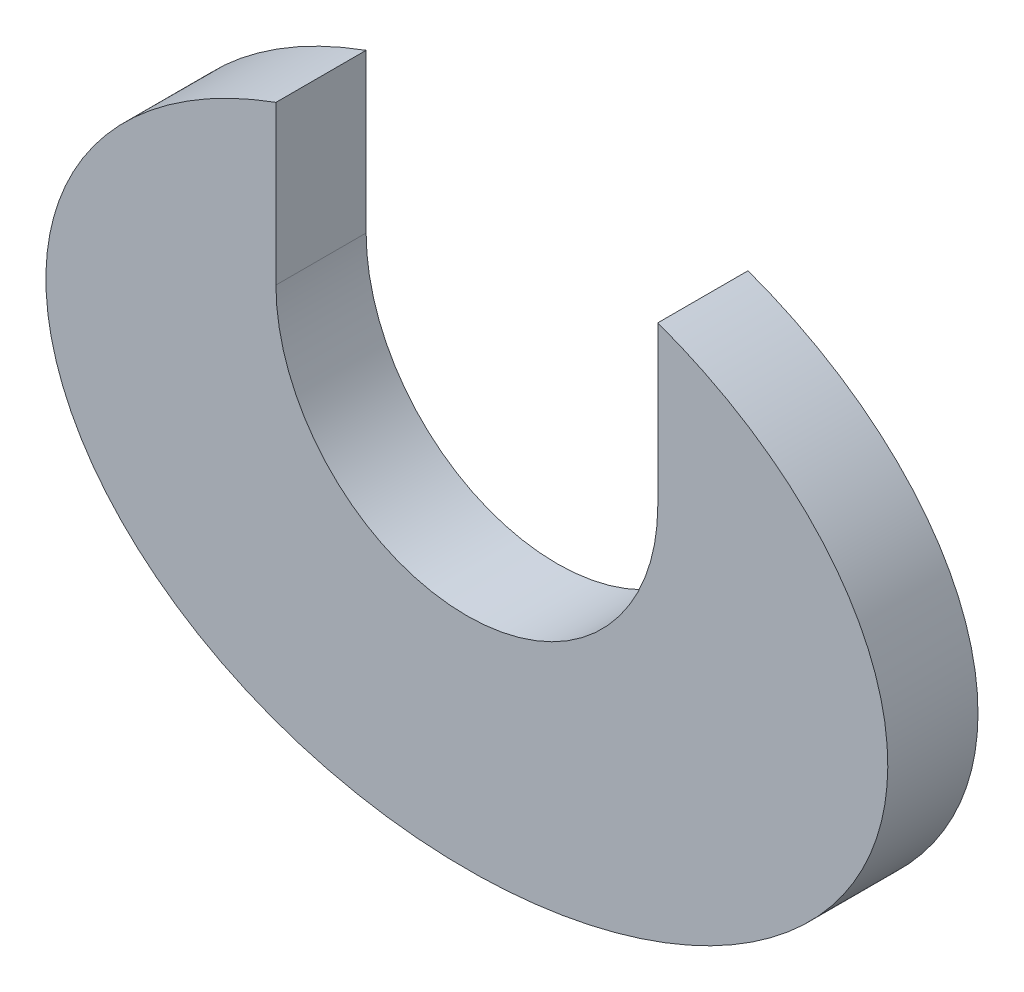
ISO-10303-21;
HEADER;
FILE_DESCRIPTION(('STEP AP214'),'2;1');
FILE_NAME('part.step','',(''),(''),'','','');
FILE_SCHEMA(('AUTOMOTIVE_DESIGN { 1 0 10303 214 1 1 1 1 }'));
ENDSEC;
DATA;
#1=APPLICATION_CONTEXT('core data for automotive mechanical design processes');
#2=APPLICATION_PROTOCOL_DEFINITION('international standard','automotive_design',2000,#1);
#3=PRODUCT_CONTEXT('',#1,'mechanical');
#4=PRODUCT('Part','Part','',(#3));
#5=PRODUCT_RELATED_PRODUCT_CATEGORY('part','',(#4));
#6=PRODUCT_DEFINITION_FORMATION('','',#4);
#7=PRODUCT_DEFINITION_CONTEXT('part definition',#1,'design');
#8=PRODUCT_DEFINITION('design','',#6,#7);
#9=PRODUCT_DEFINITION_SHAPE('','',#8);
#10=(LENGTH_UNIT() NAMED_UNIT(*) SI_UNIT(.MILLI.,.METRE.));
#11=(NAMED_UNIT(*) PLANE_ANGLE_UNIT() SI_UNIT($,.RADIAN.));
#12=(NAMED_UNIT(*) SI_UNIT($,.STERADIAN.) SOLID_ANGLE_UNIT());
#13=UNCERTAINTY_MEASURE_WITH_UNIT(LENGTH_MEASURE(1.E-05),#10,'distance_accuracy_value','');
#14=(GEOMETRIC_REPRESENTATION_CONTEXT(3) GLOBAL_UNCERTAINTY_ASSIGNED_CONTEXT((#13)) GLOBAL_UNIT_ASSIGNED_CONTEXT((#10,
#11,#12)) REPRESENTATION_CONTEXT('',''));
#15=CARTESIAN_POINT('',(0.,0.,0.));
#16=DIRECTION('',(0.,0.,1.));
#17=DIRECTION('',(1.,0.,0.));
#18=AXIS2_PLACEMENT_3D('',#15,#16,#17);
#19=CARTESIAN_POINT('',(0.,0.,1.5));
#20=DIRECTION('',(0.,0.,1.));
#21=DIRECTION('',(1.,0.,0.));
#22=AXIS2_PLACEMENT_3D('',#19,#20,#21);
#23=ELLIPSE('',#22,14.,10.);
#24=DIRECTION('',(0.,0.,-1.));
#25=VECTOR('',#24,1.);
#26=SURFACE_OF_LINEAR_EXTRUSION('',#23,#25);
#27=CARTESIAN_POINT('',(-6.35,8.91219927505929,1.5));
#28=VERTEX_POINT('',#27);
#29=CARTESIAN_POINT('',(6.35,8.91219927505929,1.5));
#30=VERTEX_POINT('',#29);
#31=EDGE_CURVE('E11',#28,#30,#23,.T.);
#32=ORIENTED_EDGE('',*,*,#31,.F.);
#33=DIRECTION('',(0.,0.,1.));
#34=VECTOR('',#33,1.);
#35=CARTESIAN_POINT('',(-6.35,8.91219927505929,-1.5));
#36=LINE('',#35,#34);
#37=CARTESIAN_POINT('',(-6.35,8.91219927505929,-1.5));
#38=VERTEX_POINT('',#37);
#39=EDGE_CURVE('E89',#38,#28,#36,.T.);
#40=ORIENTED_EDGE('',*,*,#39,.F.);
#41=CARTESIAN_POINT('',(0.,0.,-1.5));
#42=DIRECTION('',(0.,0.,1.));
#43=DIRECTION('',(1.,0.,0.));
#44=AXIS2_PLACEMENT_3D('',#41,#42,#43);
#45=ELLIPSE('',#44,14.,10.);
#46=CARTESIAN_POINT('',(6.35,8.91219927505929,-1.5));
#47=VERTEX_POINT('',#46);
#48=EDGE_CURVE('E43',#38,#47,#45,.T.);
#49=ORIENTED_EDGE('',*,*,#48,.T.);
#50=DIRECTION('',(0.,0.,1.));
#51=VECTOR('',#50,1.);
#52=CARTESIAN_POINT('',(6.35,8.91219927505929,-1.5));
#53=LINE('',#52,#51);
#54=EDGE_CURVE('E51',#47,#30,#53,.T.);
#55=ORIENTED_EDGE('',*,*,#54,.T.);
#56=EDGE_LOOP('',(#32,#40,#49,#55));
#57=FACE_BOUND('',#56,.T.);
#58=ADVANCED_FACE('F33',(#57),#26,.F.);
#59=CARTESIAN_POINT('',(0.,0.,1.5));
#60=DIRECTION('',(0.,0.,1.));
#61=DIRECTION('',(1.,0.,0.));
#62=AXIS2_PLACEMENT_3D('',#59,#60,#61);
#63=PLANE('',#62);
#64=DIRECTION('',(0.,-1.,0.));
#65=VECTOR('',#64,1.);
#66=CARTESIAN_POINT('',(-6.35,0.,1.5));
#67=LINE('',#66,#65);
#68=CARTESIAN_POINT('',(-6.35,3.65,1.5));
#69=VERTEX_POINT('',#68);
#70=EDGE_CURVE('E62',#28,#69,#67,.T.);
#71=ORIENTED_EDGE('',*,*,#70,.F.);
#72=ORIENTED_EDGE('',*,*,#31,.T.);
#73=DIRECTION('',(0.,1.,0.));
#74=VECTOR('',#73,1.);
#75=CARTESIAN_POINT('',(6.35,0.,1.5));
#76=LINE('',#75,#74);
#77=CARTESIAN_POINT('',(6.35,3.65,1.5));
#78=VERTEX_POINT('',#77);
#79=EDGE_CURVE('E78',#78,#30,#76,.T.);
#80=ORIENTED_EDGE('',*,*,#79,.F.);
#81=CARTESIAN_POINT('',(0.,3.65,1.5));
#82=DIRECTION('',(0.,0.,1.));
#83=DIRECTION('',(1.,0.,0.));
#84=AXIS2_PLACEMENT_3D('',#81,#82,#83);
#85=CIRCLE('',#84,6.35);
#86=EDGE_CURVE('E37',#69,#78,#85,.T.);
#87=ORIENTED_EDGE('',*,*,#86,.F.);
#88=EDGE_LOOP('',(#71,#72,#80,#87));
#89=FACE_BOUND('',#88,.T.);
#90=ADVANCED_FACE('F91',(#89),#63,.T.);
#91=CARTESIAN_POINT('',(0.,0.,-1.5));
#92=DIRECTION('',(0.,0.,1.));
#93=DIRECTION('',(1.,0.,0.));
#94=AXIS2_PLACEMENT_3D('',#91,#92,#93);
#95=PLANE('',#94);
#96=ORIENTED_EDGE('',*,*,#48,.F.);
#97=DIRECTION('',(0.,-1.,0.));
#98=VECTOR('',#97,1.);
#99=CARTESIAN_POINT('',(-6.35,3.65,-1.5));
#100=LINE('',#99,#98);
#101=CARTESIAN_POINT('',(-6.35,3.65,-1.5));
#102=VERTEX_POINT('',#101);
#103=EDGE_CURVE('E96',#38,#102,#100,.T.);
#104=ORIENTED_EDGE('',*,*,#103,.T.);
#105=CARTESIAN_POINT('',(0.,3.65,-1.5));
#106=DIRECTION('',(0.,0.,1.));
#107=DIRECTION('',(1.,0.,0.));
#108=AXIS2_PLACEMENT_3D('',#105,#106,#107);
#109=CIRCLE('',#108,6.35);
#110=CARTESIAN_POINT('',(6.35,3.65,-1.5));
#111=VERTEX_POINT('',#110);
#112=EDGE_CURVE('E103',#102,#111,#109,.T.);
#113=ORIENTED_EDGE('',*,*,#112,.T.);
#114=DIRECTION('',(0.,1.,0.));
#115=VECTOR('',#114,1.);
#116=CARTESIAN_POINT('',(6.35,3.65,-1.5));
#117=LINE('',#116,#115);
#118=EDGE_CURVE('E101',#111,#47,#117,.T.);
#119=ORIENTED_EDGE('',*,*,#118,.T.);
#120=EDGE_LOOP('',(#96,#104,#113,#119));
#121=FACE_BOUND('',#120,.T.);
#122=ADVANCED_FACE('F106',(#121),#95,.F.);
#123=CARTESIAN_POINT('',(0.,3.65,-1.5));
#124=DIRECTION('',(0.,0.,1.));
#125=DIRECTION('',(1.,0.,0.));
#126=AXIS2_PLACEMENT_3D('',#123,#124,#125);
#127=CYLINDRICAL_SURFACE('',#126,6.35);
#128=ORIENTED_EDGE('',*,*,#86,.T.);
#129=DIRECTION('',(0.,0.,1.));
#130=VECTOR('',#129,1.);
#131=CARTESIAN_POINT('',(6.35,3.65,-1.5));
#132=LINE('',#131,#130);
#133=EDGE_CURVE('E67',#111,#78,#132,.T.);
#134=ORIENTED_EDGE('',*,*,#133,.F.);
#135=ORIENTED_EDGE('',*,*,#112,.F.);
#136=DIRECTION('',(0.,0.,1.));
#137=VECTOR('',#136,1.);
#138=CARTESIAN_POINT('',(-6.35,3.65,-1.5));
#139=LINE('',#138,#137);
#140=EDGE_CURVE('E82',#102,#69,#139,.T.);
#141=ORIENTED_EDGE('',*,*,#140,.T.);
#142=EDGE_LOOP('',(#128,#134,#135,#141));
#143=FACE_BOUND('',#142,.T.);
#144=ADVANCED_FACE('F107',(#143),#127,.F.);
#145=CARTESIAN_POINT('',(-6.35,3.65,-1.5));
#146=DIRECTION('',(-1.,0.,0.));
#147=DIRECTION('',(0.,0.,1.));
#148=AXIS2_PLACEMENT_3D('',#145,#146,#147);
#149=PLANE('',#148);
#150=ORIENTED_EDGE('',*,*,#70,.T.);
#151=ORIENTED_EDGE('',*,*,#140,.F.);
#152=ORIENTED_EDGE('',*,*,#103,.F.);
#153=ORIENTED_EDGE('',*,*,#39,.T.);
#154=EDGE_LOOP('',(#150,#151,#152,#153));
#155=FACE_BOUND('',#154,.T.);
#156=ADVANCED_FACE('F108',(#155),#149,.F.);
#157=CARTESIAN_POINT('',(6.35,3.65,-1.5));
#158=DIRECTION('',(1.,0.,0.));
#159=DIRECTION('',(0.,0.,-1.));
#160=AXIS2_PLACEMENT_3D('',#157,#158,#159);
#161=PLANE('',#160);
#162=ORIENTED_EDGE('',*,*,#79,.T.);
#163=ORIENTED_EDGE('',*,*,#54,.F.);
#164=ORIENTED_EDGE('',*,*,#118,.F.);
#165=ORIENTED_EDGE('',*,*,#133,.T.);
#166=EDGE_LOOP('',(#162,#163,#164,#165));
#167=FACE_BOUND('',#166,.T.);
#168=ADVANCED_FACE('F79',(#167),#161,.F.);
#169=CLOSED_SHELL('',(#58,#90,#122,#144,#156,#168));
#170=MANIFOLD_SOLID_BREP('B2',#169);
#171=ADVANCED_BREP_SHAPE_REPRESENTATION('',(#18,#170),#14);
#172=SHAPE_DEFINITION_REPRESENTATION(#9,#171);
ENDSEC;
END-ISO-10303-21;
